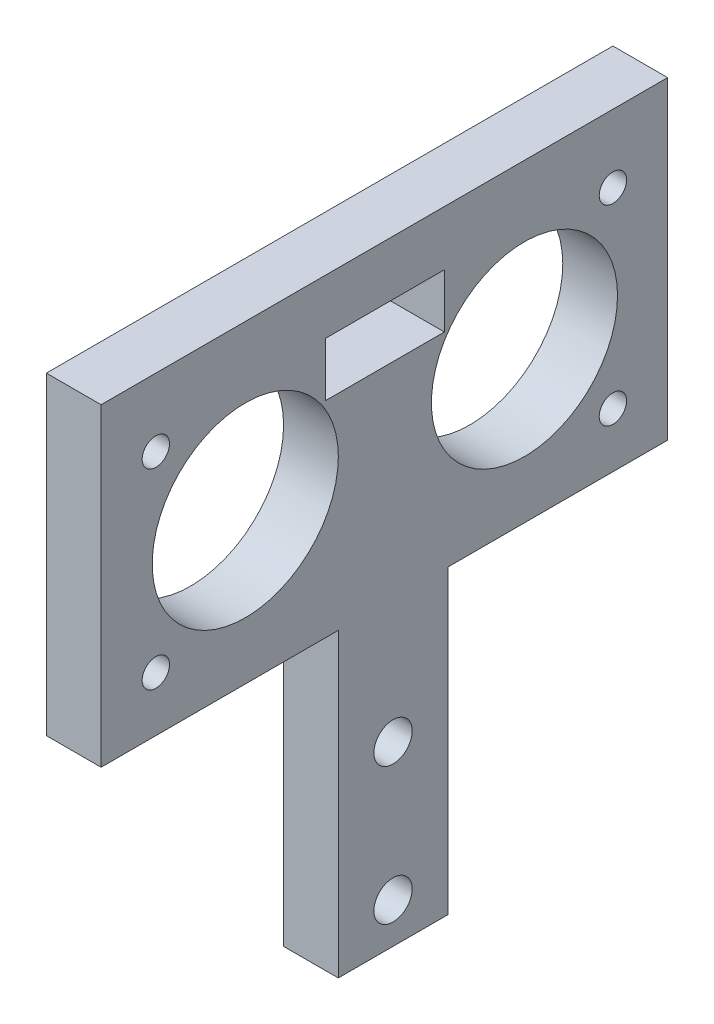
ISO-10303-21;
HEADER;
FILE_DESCRIPTION(('STEP AP214'),'2;1');
FILE_NAME('part.step','',(''),(''),'','','');
FILE_SCHEMA(('AUTOMOTIVE_DESIGN { 1 0 10303 214 1 1 1 1 }'));
ENDSEC;
DATA;
#1=APPLICATION_CONTEXT('core data for automotive mechanical design processes');
#2=APPLICATION_PROTOCOL_DEFINITION('international standard','automotive_design',2000,#1);
#3=PRODUCT_CONTEXT('',#1,'mechanical');
#4=PRODUCT('Part','Part','',(#3));
#5=PRODUCT_RELATED_PRODUCT_CATEGORY('part','',(#4));
#6=PRODUCT_DEFINITION_FORMATION('','',#4);
#7=PRODUCT_DEFINITION_CONTEXT('part definition',#1,'design');
#8=PRODUCT_DEFINITION('design','',#6,#7);
#9=PRODUCT_DEFINITION_SHAPE('','',#8);
#10=(LENGTH_UNIT() NAMED_UNIT(*) SI_UNIT(.MILLI.,.METRE.));
#11=(NAMED_UNIT(*) PLANE_ANGLE_UNIT() SI_UNIT($,.RADIAN.));
#12=(NAMED_UNIT(*) SI_UNIT($,.STERADIAN.) SOLID_ANGLE_UNIT());
#13=UNCERTAINTY_MEASURE_WITH_UNIT(LENGTH_MEASURE(1.E-05),#10,'distance_accuracy_value','');
#14=(GEOMETRIC_REPRESENTATION_CONTEXT(3) GLOBAL_UNCERTAINTY_ASSIGNED_CONTEXT((#13)) GLOBAL_UNIT_ASSIGNED_CONTEXT((#10,
#11,#12)) REPRESENTATION_CONTEXT('',''));
#15=CARTESIAN_POINT('',(0.,0.,0.));
#16=DIRECTION('',(0.,0.,1.));
#17=DIRECTION('',(1.,0.,0.));
#18=AXIS2_PLACEMENT_3D('',#15,#16,#17);
#19=CARTESIAN_POINT('',(0.,0.,0.));
#20=DIRECTION('',(1.,0.,0.));
#21=DIRECTION('',(0.,0.,-1.));
#22=AXIS2_PLACEMENT_3D('',#19,#20,#21);
#23=PLANE('',#22);
#24=CARTESIAN_POINT('',(0.,-48.26,0.));
#25=DIRECTION('',(1.,0.,0.));
#26=DIRECTION('',(0.,0.,-1.));
#27=AXIS2_PLACEMENT_3D('',#24,#25,#26);
#28=CIRCLE('',#27,1.778);
#29=CARTESIAN_POINT('',(0.,-48.26,1.778));
#30=VERTEX_POINT('',#29);
#31=EDGE_CURVE('E248',#30,#30,#28,.T.);
#32=ORIENTED_EDGE('',*,*,#31,.T.);
#33=EDGE_LOOP('',(#32));
#34=FACE_BOUND('',#33,.T.);
#35=CARTESIAN_POINT('',(0.,-35.56,0.));
#36=DIRECTION('',(1.,0.,0.));
#37=DIRECTION('',(0.,0.,-1.));
#38=AXIS2_PLACEMENT_3D('',#35,#36,#37);
#39=CIRCLE('',#38,1.778);
#40=CARTESIAN_POINT('',(0.,-35.56,1.778));
#41=VERTEX_POINT('',#40);
#42=EDGE_CURVE('E253',#41,#41,#39,.T.);
#43=ORIENTED_EDGE('',*,*,#42,.T.);
#44=EDGE_LOOP('',(#43));
#45=FACE_BOUND('',#44,.T.);
#46=CARTESIAN_POINT('',(0.,-10.1005701276087,-12.1970297029703));
#47=DIRECTION('',(1.,0.,0.));
#48=DIRECTION('',(0.,0.,-1.));
#49=AXIS2_PLACEMENT_3D('',#46,#47,#48);
#50=CIRCLE('',#49,8.636);
#51=CARTESIAN_POINT('',(0.,-10.1005701276087,-20.8330297029703));
#52=VERTEX_POINT('',#51);
#53=EDGE_CURVE('E176',#52,#52,#50,.T.);
#54=ORIENTED_EDGE('',*,*,#53,.T.);
#55=EDGE_LOOP('',(#54));
#56=FACE_BOUND('',#55,.T.);
#57=CARTESIAN_POINT('',(0.,-10.1005701276087,13.7109702970297));
#58=DIRECTION('',(1.,0.,0.));
#59=DIRECTION('',(0.,0.,-1.));
#60=AXIS2_PLACEMENT_3D('',#57,#58,#59);
#61=CIRCLE('',#60,8.636);
#62=CARTESIAN_POINT('',(0.,-10.1005701276087,5.07497029702969));
#63=VERTEX_POINT('',#62);
#64=EDGE_CURVE('E175',#63,#63,#61,.T.);
#65=ORIENTED_EDGE('',*,*,#64,.T.);
#66=EDGE_LOOP('',(#65));
#67=FACE_BOUND('',#66,.T.);
#68=CARTESIAN_POINT('',(0.,-1.22390774690241,22.0101702970577));
#69=DIRECTION('',(1.,0.,0.));
#70=DIRECTION('',(0.,0.,-1.));
#71=AXIS2_PLACEMENT_3D('',#68,#69,#70);
#72=CIRCLE('',#71,1.27);
#73=CARTESIAN_POINT('',(0.,-1.22390774690241,20.7401702970577));
#74=VERTEX_POINT('',#73);
#75=EDGE_CURVE('E224',#74,#74,#72,.T.);
#76=ORIENTED_EDGE('',*,*,#75,.T.);
#77=EDGE_LOOP('',(#76));
#78=FACE_BOUND('',#77,.T.);
#79=CARTESIAN_POINT('',(0.,-18.9772325083057,22.0101702970577));
#80=DIRECTION('',(1.,0.,0.));
#81=DIRECTION('',(0.,0.,1.));
#82=AXIS2_PLACEMENT_3D('',#79,#80,#81);
#83=CIRCLE('',#82,1.27);
#84=CARTESIAN_POINT('',(0.,-18.9772325083057,23.2801702970577));
#85=VERTEX_POINT('',#84);
#86=EDGE_CURVE('E221',#85,#85,#83,.T.);
#87=ORIENTED_EDGE('',*,*,#86,.T.);
#88=EDGE_LOOP('',(#87));
#89=FACE_BOUND('',#88,.T.);
#90=CARTESIAN_POINT('',(0.,-18.9772325083057,-20.4042297029423));
#91=DIRECTION('',(1.,0.,0.));
#92=DIRECTION('',(0.,0.,-1.));
#93=AXIS2_PLACEMENT_3D('',#90,#91,#92);
#94=CIRCLE('',#93,1.27);
#95=CARTESIAN_POINT('',(0.,-18.9772325083057,-21.6742297029423));
#96=VERTEX_POINT('',#95);
#97=EDGE_CURVE('E225',#96,#96,#94,.T.);
#98=ORIENTED_EDGE('',*,*,#97,.T.);
#99=EDGE_LOOP('',(#98));
#100=FACE_BOUND('',#99,.T.);
#101=CARTESIAN_POINT('',(0.,-1.22390774690241,-20.4042297029423));
#102=DIRECTION('',(1.,0.,0.));
#103=DIRECTION('',(0.,0.,1.));
#104=AXIS2_PLACEMENT_3D('',#101,#102,#103);
#105=CIRCLE('',#104,1.27);
#106=CARTESIAN_POINT('',(0.,-1.22390774690241,-19.1342297029423));
#107=VERTEX_POINT('',#106);
#108=EDGE_CURVE('E220',#107,#107,#105,.T.);
#109=ORIENTED_EDGE('',*,*,#108,.T.);
#110=EDGE_LOOP('',(#109));
#111=FACE_BOUND('',#110,.T.);
#112=DIRECTION('',(0.,-1.,0.));
#113=VECTOR('',#112,1.);
#114=CARTESIAN_POINT('',(0.,7.11236625150491E-13,6.25821412550992));
#115=LINE('',#114,#113);
#116=CARTESIAN_POINT('',(0.,7.11236625150491E-13,6.25821412550992));
#117=VERTEX_POINT('',#116);
#118=CARTESIAN_POINT('',(0.,-5.00379999999929,6.25821412550992));
#119=VERTEX_POINT('',#118);
#120=EDGE_CURVE('E187',#117,#119,#115,.T.);
#121=ORIENTED_EDGE('',*,*,#120,.T.);
#122=DIRECTION('',(0.,0.,-1.));
#123=VECTOR('',#122,1.);
#124=CARTESIAN_POINT('',(0.,-5.00379999999929,6.25821412550992));
#125=LINE('',#124,#123);
#126=CARTESIAN_POINT('',(0.,-5.00379999999929,-4.76538587449008));
#127=VERTEX_POINT('',#126);
#128=EDGE_CURVE('E190',#119,#127,#125,.T.);
#129=ORIENTED_EDGE('',*,*,#128,.T.);
#130=DIRECTION('',(0.,1.,0.));
#131=VECTOR('',#130,1.);
#132=CARTESIAN_POINT('',(0.,7.11236625150491E-13,-4.76538587449008));
#133=LINE('',#132,#131);
#134=CARTESIAN_POINT('',(0.,7.11236625150491E-13,-4.76538587449008));
#135=VERTEX_POINT('',#134);
#136=EDGE_CURVE('E193',#127,#135,#133,.T.);
#137=ORIENTED_EDGE('',*,*,#136,.T.);
#138=DIRECTION('',(0.,0.,1.));
#139=VECTOR('',#138,1.);
#140=CARTESIAN_POINT('',(0.,7.11236625150491E-13,6.25821412550992));
#141=LINE('',#140,#139);
#142=EDGE_CURVE('E196',#135,#117,#141,.T.);
#143=ORIENTED_EDGE('',*,*,#142,.T.);
#144=EDGE_LOOP('',(#121,#129,#137,#143));
#145=FACE_BOUND('',#144,.T.);
#146=DIRECTION('',(0.,0.,1.));
#147=VECTOR('',#146,1.);
#148=CARTESIAN_POINT('',(0.,-51.9972325083057,40.4730871411358));
#149=LINE('',#148,#147);
#150=CARTESIAN_POINT('',(0.,-51.9972325083057,-5.07999999999999));
#151=VERTEX_POINT('',#150);
#152=CARTESIAN_POINT('',(0.,-51.9972325083057,5.07999999999999));
#153=VERTEX_POINT('',#152);
#154=EDGE_CURVE('E120',#151,#153,#149,.T.);
#155=ORIENTED_EDGE('',*,*,#154,.T.);
#156=DIRECTION('',(0.,1.,0.));
#157=VECTOR('',#156,1.);
#158=CARTESIAN_POINT('',(0.,-24.0572325083057,5.08));
#159=LINE('',#158,#157);
#160=CARTESIAN_POINT('',(0.,-24.0572325083057,5.08));
#161=VERTEX_POINT('',#160);
#162=EDGE_CURVE('E141',#153,#161,#159,.T.);
#163=ORIENTED_EDGE('',*,*,#162,.T.);
#164=DIRECTION('',(0.,0.,1.));
#165=VECTOR('',#164,1.);
#166=CARTESIAN_POINT('',(0.,-24.0572325083057,30.6593827177156));
#167=LINE('',#166,#165);
#168=CARTESIAN_POINT('',(0.,-24.0572325083057,27.0901702970577));
#169=VERTEX_POINT('',#168);
#170=EDGE_CURVE('E262',#161,#169,#167,.T.);
#171=ORIENTED_EDGE('',*,*,#170,.T.);
#172=DIRECTION('',(0.,-1.,0.));
#173=VECTOR('',#172,1.);
#174=CARTESIAN_POINT('',(0.,5.08,27.0901702970577));
#175=LINE('',#174,#173);
#176=CARTESIAN_POINT('',(0.,5.08,27.0901702970577));
#177=VERTEX_POINT('',#176);
#178=EDGE_CURVE('E155',#177,#169,#175,.T.);
#179=ORIENTED_EDGE('',*,*,#178,.F.);
#180=DIRECTION('',(0.,0.,1.));
#181=VECTOR('',#180,1.);
#182=CARTESIAN_POINT('',(0.,5.08,27.0901702970577));
#183=LINE('',#182,#181);
#184=CARTESIAN_POINT('',(0.,5.08,-25.4842297029423));
#185=VERTEX_POINT('',#184);
#186=EDGE_CURVE('E160',#185,#177,#183,.T.);
#187=ORIENTED_EDGE('',*,*,#186,.F.);
#188=DIRECTION('',(0.,1.,0.));
#189=VECTOR('',#188,1.);
#190=CARTESIAN_POINT('',(0.,5.08,-25.4842297029423));
#191=LINE('',#190,#189);
#192=CARTESIAN_POINT('',(0.,-24.0572325083057,-25.4842297029423));
#193=VERTEX_POINT('',#192);
#194=EDGE_CURVE('E158',#193,#185,#191,.T.);
#195=ORIENTED_EDGE('',*,*,#194,.F.);
#196=DIRECTION('',(0.,0.,1.));
#197=VECTOR('',#196,1.);
#198=CARTESIAN_POINT('',(0.,-24.0572325083057,-30.6593827177156));
#199=LINE('',#198,#197);
#200=CARTESIAN_POINT('',(0.,-24.0572325083057,-5.08));
#201=VERTEX_POINT('',#200);
#202=EDGE_CURVE('E136',#193,#201,#199,.T.);
#203=ORIENTED_EDGE('',*,*,#202,.T.);
#204=DIRECTION('',(0.,-1.,0.));
#205=VECTOR('',#204,1.);
#206=CARTESIAN_POINT('',(0.,-24.0572325083057,-5.08));
#207=LINE('',#206,#205);
#208=EDGE_CURVE('E133',#201,#151,#207,.T.);
#209=ORIENTED_EDGE('',*,*,#208,.T.);
#210=EDGE_LOOP('',(#155,#163,#171,#179,#187,#195,#203,#209));
#211=FACE_BOUND('',#210,.T.);
#212=ADVANCED_FACE('F32',(#34,#45,#56,#67,#78,#89,#100,#111,#145,#211),#23,.F.);
#213=CARTESIAN_POINT('',(5.08,0.,0.));
#214=DIRECTION('',(1.,0.,0.));
#215=DIRECTION('',(0.,0.,-1.));
#216=AXIS2_PLACEMENT_3D('',#213,#214,#215);
#217=PLANE('',#216);
#218=CARTESIAN_POINT('',(5.08,-48.26,0.));
#219=DIRECTION('',(1.,0.,0.));
#220=DIRECTION('',(0.,0.,-1.));
#221=AXIS2_PLACEMENT_3D('',#218,#219,#220);
#222=CIRCLE('',#221,1.778);
#223=CARTESIAN_POINT('',(5.08,-48.26,1.778));
#224=VERTEX_POINT('',#223);
#225=EDGE_CURVE('E35',#224,#224,#222,.F.);
#226=ORIENTED_EDGE('',*,*,#225,.T.);
#227=EDGE_LOOP('',(#226));
#228=FACE_BOUND('',#227,.T.);
#229=CARTESIAN_POINT('',(5.08,-35.56,0.));
#230=DIRECTION('',(1.,0.,0.));
#231=DIRECTION('',(0.,0.,-1.));
#232=AXIS2_PLACEMENT_3D('',#229,#230,#231);
#233=CIRCLE('',#232,1.778);
#234=CARTESIAN_POINT('',(5.08,-35.56,1.778));
#235=VERTEX_POINT('',#234);
#236=EDGE_CURVE('E246',#235,#235,#233,.F.);
#237=ORIENTED_EDGE('',*,*,#236,.T.);
#238=EDGE_LOOP('',(#237));
#239=FACE_BOUND('',#238,.T.);
#240=CARTESIAN_POINT('',(5.08,-10.1005701276087,-12.1970297029703));
#241=DIRECTION('',(1.,0.,0.));
#242=DIRECTION('',(0.,0.,-1.));
#243=AXIS2_PLACEMENT_3D('',#240,#241,#242);
#244=CIRCLE('',#243,8.636);
#245=CARTESIAN_POINT('',(5.08,-10.1005701276087,-20.8330297029703));
#246=VERTEX_POINT('',#245);
#247=EDGE_CURVE('E184',#246,#246,#244,.F.);
#248=ORIENTED_EDGE('',*,*,#247,.T.);
#249=EDGE_LOOP('',(#248));
#250=FACE_BOUND('',#249,.T.);
#251=CARTESIAN_POINT('',(5.08,-10.1005701276087,13.7109702970297));
#252=DIRECTION('',(1.,0.,0.));
#253=DIRECTION('',(0.,0.,-1.));
#254=AXIS2_PLACEMENT_3D('',#251,#252,#253);
#255=CIRCLE('',#254,8.636);
#256=CARTESIAN_POINT('',(5.08,-10.1005701276087,5.07497029702969));
#257=VERTEX_POINT('',#256);
#258=EDGE_CURVE('E179',#257,#257,#255,.F.);
#259=ORIENTED_EDGE('',*,*,#258,.T.);
#260=EDGE_LOOP('',(#259));
#261=FACE_BOUND('',#260,.T.);
#262=CARTESIAN_POINT('',(5.08,-1.22390774690241,-20.4042297029423));
#263=DIRECTION('',(1.,0.,0.));
#264=DIRECTION('',(0.,0.,-1.));
#265=AXIS2_PLACEMENT_3D('',#262,#263,#264);
#266=CIRCLE('',#265,1.27);
#267=CARTESIAN_POINT('',(5.08,-1.22390774690241,-21.6742297029423));
#268=VERTEX_POINT('',#267);
#269=EDGE_CURVE('E241',#268,#268,#266,.F.);
#270=ORIENTED_EDGE('',*,*,#269,.T.);
#271=EDGE_LOOP('',(#270));
#272=FACE_BOUND('',#271,.T.);
#273=CARTESIAN_POINT('',(5.08,-18.9772325083057,-20.4042297029423));
#274=DIRECTION('',(1.,0.,0.));
#275=DIRECTION('',(0.,0.,-1.));
#276=AXIS2_PLACEMENT_3D('',#273,#274,#275);
#277=CIRCLE('',#276,1.27);
#278=CARTESIAN_POINT('',(5.08,-18.9772325083057,-21.6742297029423));
#279=VERTEX_POINT('',#278);
#280=EDGE_CURVE('E238',#279,#279,#277,.F.);
#281=ORIENTED_EDGE('',*,*,#280,.T.);
#282=EDGE_LOOP('',(#281));
#283=FACE_BOUND('',#282,.T.);
#284=CARTESIAN_POINT('',(5.08,-18.9772325083057,22.0101702970577));
#285=DIRECTION('',(1.,0.,0.));
#286=DIRECTION('',(0.,0.,-1.));
#287=AXIS2_PLACEMENT_3D('',#284,#285,#286);
#288=CIRCLE('',#287,1.27);
#289=CARTESIAN_POINT('',(5.08,-18.9772325083057,20.7401702970577));
#290=VERTEX_POINT('',#289);
#291=EDGE_CURVE('E235',#290,#290,#288,.F.);
#292=ORIENTED_EDGE('',*,*,#291,.T.);
#293=EDGE_LOOP('',(#292));
#294=FACE_BOUND('',#293,.T.);
#295=CARTESIAN_POINT('',(5.08,-1.22390774690241,22.0101702970577));
#296=DIRECTION('',(1.,0.,0.));
#297=DIRECTION('',(0.,0.,-1.));
#298=AXIS2_PLACEMENT_3D('',#295,#296,#297);
#299=CIRCLE('',#298,1.27);
#300=CARTESIAN_POINT('',(5.08,-1.22390774690241,20.7401702970577));
#301=VERTEX_POINT('',#300);
#302=EDGE_CURVE('E232',#301,#301,#299,.F.);
#303=ORIENTED_EDGE('',*,*,#302,.T.);
#304=EDGE_LOOP('',(#303));
#305=FACE_BOUND('',#304,.T.);
#306=DIRECTION('',(0.,0.,1.));
#307=VECTOR('',#306,1.);
#308=CARTESIAN_POINT('',(5.08,-5.00379999999929,0.));
#309=LINE('',#308,#307);
#310=CARTESIAN_POINT('',(5.08,-5.00379999999929,-4.76538587449008));
#311=VERTEX_POINT('',#310);
#312=CARTESIAN_POINT('',(5.08,-5.00379999999929,6.25821412550992));
#313=VERTEX_POINT('',#312);
#314=EDGE_CURVE('E214',#311,#313,#309,.T.);
#315=ORIENTED_EDGE('',*,*,#314,.T.);
#316=DIRECTION('',(0.,1.,0.));
#317=VECTOR('',#316,1.);
#318=CARTESIAN_POINT('',(5.08,0.,6.25821412550992));
#319=LINE('',#318,#317);
#320=CARTESIAN_POINT('',(5.08,7.11236625150491E-13,6.25821412550992));
#321=VERTEX_POINT('',#320);
#322=EDGE_CURVE('E217',#313,#321,#319,.T.);
#323=ORIENTED_EDGE('',*,*,#322,.T.);
#324=DIRECTION('',(0.,0.,-1.));
#325=VECTOR('',#324,1.);
#326=CARTESIAN_POINT('',(5.08,7.11236625150491E-13,0.));
#327=LINE('',#326,#325);
#328=CARTESIAN_POINT('',(5.08,7.11236625150491E-13,-4.76538587449008));
#329=VERTEX_POINT('',#328);
#330=EDGE_CURVE('E208',#321,#329,#327,.T.);
#331=ORIENTED_EDGE('',*,*,#330,.T.);
#332=DIRECTION('',(0.,-1.,0.));
#333=VECTOR('',#332,1.);
#334=CARTESIAN_POINT('',(5.08,0.,-4.76538587449008));
#335=LINE('',#334,#333);
#336=EDGE_CURVE('E211',#329,#311,#335,.T.);
#337=ORIENTED_EDGE('',*,*,#336,.T.);
#338=EDGE_LOOP('',(#315,#323,#331,#337));
#339=FACE_BOUND('',#338,.T.);
#340=DIRECTION('',(0.,-1.,0.));
#341=VECTOR('',#340,1.);
#342=CARTESIAN_POINT('',(5.08,0.,5.08));
#343=LINE('',#342,#341);
#344=CARTESIAN_POINT('',(5.08,-24.0572325083057,5.08));
#345=VERTEX_POINT('',#344);
#346=CARTESIAN_POINT('',(5.08,-51.9972325083057,5.07999999999999));
#347=VERTEX_POINT('',#346);
#348=EDGE_CURVE('E152',#345,#347,#343,.T.);
#349=ORIENTED_EDGE('',*,*,#348,.T.);
#350=DIRECTION('',(0.,0.,-1.));
#351=VECTOR('',#350,1.);
#352=CARTESIAN_POINT('',(5.08,-51.9972325083057,0.));
#353=LINE('',#352,#351);
#354=CARTESIAN_POINT('',(5.08,-51.9972325083057,-5.08));
#355=VERTEX_POINT('',#354);
#356=EDGE_CURVE('E48',#347,#355,#353,.T.);
#357=ORIENTED_EDGE('',*,*,#356,.T.);
#358=DIRECTION('',(0.,1.,0.));
#359=VECTOR('',#358,1.);
#360=CARTESIAN_POINT('',(5.08,0.,-5.08));
#361=LINE('',#360,#359);
#362=CARTESIAN_POINT('',(5.08,-24.0572325083057,-5.08));
#363=VERTEX_POINT('',#362);
#364=EDGE_CURVE('E135',#355,#363,#361,.T.);
#365=ORIENTED_EDGE('',*,*,#364,.T.);
#366=DIRECTION('',(0.,0.,-1.));
#367=VECTOR('',#366,1.);
#368=CARTESIAN_POINT('',(5.08,-24.0572325083057,0.));
#369=LINE('',#368,#367);
#370=CARTESIAN_POINT('',(5.08,-24.0572325083057,-25.4842297029423));
#371=VERTEX_POINT('',#370);
#372=EDGE_CURVE('E146',#363,#371,#369,.T.);
#373=ORIENTED_EDGE('',*,*,#372,.T.);
#374=DIRECTION('',(0.,-1.,0.));
#375=VECTOR('',#374,1.);
#376=CARTESIAN_POINT('',(5.08,0.,-25.4842297029423));
#377=LINE('',#376,#375);
#378=CARTESIAN_POINT('',(5.08,5.08,-25.4842297029423));
#379=VERTEX_POINT('',#378);
#380=EDGE_CURVE('E170',#379,#371,#377,.T.);
#381=ORIENTED_EDGE('',*,*,#380,.F.);
#382=DIRECTION('',(0.,0.,-1.));
#383=VECTOR('',#382,1.);
#384=CARTESIAN_POINT('',(5.08,5.08,0.));
#385=LINE('',#384,#383);
#386=CARTESIAN_POINT('',(5.08,5.08,27.0901702970577));
#387=VERTEX_POINT('',#386);
#388=EDGE_CURVE('E168',#387,#379,#385,.T.);
#389=ORIENTED_EDGE('',*,*,#388,.F.);
#390=DIRECTION('',(0.,1.,0.));
#391=VECTOR('',#390,1.);
#392=CARTESIAN_POINT('',(5.08,0.,27.0901702970577));
#393=LINE('',#392,#391);
#394=CARTESIAN_POINT('',(5.08,-24.0572325083057,27.0901702970577));
#395=VERTEX_POINT('',#394);
#396=EDGE_CURVE('E173',#395,#387,#393,.T.);
#397=ORIENTED_EDGE('',*,*,#396,.F.);
#398=DIRECTION('',(0.,0.,-1.));
#399=VECTOR('',#398,1.);
#400=CARTESIAN_POINT('',(5.08,-24.0572325083057,0.));
#401=LINE('',#400,#399);
#402=EDGE_CURVE('E55',#395,#345,#401,.T.);
#403=ORIENTED_EDGE('',*,*,#402,.T.);
#404=EDGE_LOOP('',(#349,#357,#365,#373,#381,#389,#397,#403));
#405=FACE_BOUND('',#404,.T.);
#406=ADVANCED_FACE('F287',(#228,#239,#250,#261,#272,#283,#294,#305,#339,#405),#217,.T.);
#407=CARTESIAN_POINT('',(10.16,-24.0572325083057,-5.08));
#408=DIRECTION('',(0.,0.,-1.));
#409=DIRECTION('',(0.,1.,0.));
#410=AXIS2_PLACEMENT_3D('',#407,#408,#409);
#411=PLANE('',#410);
#412=ORIENTED_EDGE('',*,*,#364,.F.);
#413=DIRECTION('',(-1.,0.,0.));
#414=VECTOR('',#413,1.);
#415=CARTESIAN_POINT('',(10.16,-51.9972325083057,-5.07999999999999));
#416=LINE('',#415,#414);
#417=EDGE_CURVE('E123',#355,#151,#416,.T.);
#418=ORIENTED_EDGE('',*,*,#417,.T.);
#419=ORIENTED_EDGE('',*,*,#208,.F.);
#420=DIRECTION('',(-1.,0.,0.));
#421=VECTOR('',#420,1.);
#422=CARTESIAN_POINT('',(10.16,-24.0572325083057,-5.08));
#423=LINE('',#422,#421);
#424=EDGE_CURVE('E139',#363,#201,#423,.T.);
#425=ORIENTED_EDGE('',*,*,#424,.F.);
#426=EDGE_LOOP('',(#412,#418,#419,#425));
#427=FACE_BOUND('',#426,.T.);
#428=ADVANCED_FACE('F131',(#427),#411,.T.);
#429=CARTESIAN_POINT('',(10.16,-24.0572325083057,5.08));
#430=DIRECTION('',(0.,0.,1.));
#431=DIRECTION('',(0.,-1.,0.));
#432=AXIS2_PLACEMENT_3D('',#429,#430,#431);
#433=PLANE('',#432);
#434=ORIENTED_EDGE('',*,*,#162,.F.);
#435=DIRECTION('',(1.,0.,0.));
#436=VECTOR('',#435,1.);
#437=CARTESIAN_POINT('',(10.16,-51.9972325083057,5.07999999999999));
#438=LINE('',#437,#436);
#439=EDGE_CURVE('E11',#153,#347,#438,.T.);
#440=ORIENTED_EDGE('',*,*,#439,.T.);
#441=ORIENTED_EDGE('',*,*,#348,.F.);
#442=DIRECTION('',(-1.,0.,0.));
#443=VECTOR('',#442,1.);
#444=CARTESIAN_POINT('',(10.16,-24.0572325083057,5.08));
#445=LINE('',#444,#443);
#446=EDGE_CURVE('E149',#345,#161,#445,.T.);
#447=ORIENTED_EDGE('',*,*,#446,.T.);
#448=EDGE_LOOP('',(#434,#440,#441,#447));
#449=FACE_BOUND('',#448,.T.);
#450=ADVANCED_FACE('F267',(#449),#433,.T.);
#451=CARTESIAN_POINT('',(25.908,5.08,27.0901702970577));
#452=DIRECTION('',(0.,0.,-1.));
#453=DIRECTION('',(0.,1.,0.));
#454=AXIS2_PLACEMENT_3D('',#451,#452,#453);
#455=PLANE('',#454);
#456=DIRECTION('',(-1.,0.,0.));
#457=VECTOR('',#456,1.);
#458=CARTESIAN_POINT('',(25.908,-24.0572325083057,27.0901702970577));
#459=LINE('',#458,#457);
#460=EDGE_CURVE('E40',#395,#169,#459,.T.);
#461=ORIENTED_EDGE('',*,*,#460,.F.);
#462=ORIENTED_EDGE('',*,*,#396,.T.);
#463=DIRECTION('',(-1.,0.,0.));
#464=VECTOR('',#463,1.);
#465=CARTESIAN_POINT('',(25.908,5.08,27.0901702970577));
#466=LINE('',#465,#464);
#467=EDGE_CURVE('E163',#387,#177,#466,.T.);
#468=ORIENTED_EDGE('',*,*,#467,.T.);
#469=ORIENTED_EDGE('',*,*,#178,.T.);
#470=EDGE_LOOP('',(#461,#462,#468,#469));
#471=FACE_BOUND('',#470,.T.);
#472=ADVANCED_FACE('F272',(#471),#455,.F.);
#473=CARTESIAN_POINT('',(25.908,5.08,-25.4842297029423));
#474=DIRECTION('',(0.,0.,1.));
#475=DIRECTION('',(0.,-1.,0.));
#476=AXIS2_PLACEMENT_3D('',#473,#474,#475);
#477=PLANE('',#476);
#478=DIRECTION('',(1.,0.,0.));
#479=VECTOR('',#478,1.);
#480=CARTESIAN_POINT('',(25.908,-24.0572325083057,-25.4842297029423));
#481=LINE('',#480,#479);
#482=EDGE_CURVE('E244',#193,#371,#481,.T.);
#483=ORIENTED_EDGE('',*,*,#482,.F.);
#484=ORIENTED_EDGE('',*,*,#194,.T.);
#485=DIRECTION('',(-1.,0.,0.));
#486=VECTOR('',#485,1.);
#487=CARTESIAN_POINT('',(25.908,5.08,-25.4842297029423));
#488=LINE('',#487,#486);
#489=EDGE_CURVE('E165',#379,#185,#488,.T.);
#490=ORIENTED_EDGE('',*,*,#489,.F.);
#491=ORIENTED_EDGE('',*,*,#380,.T.);
#492=EDGE_LOOP('',(#483,#484,#490,#491));
#493=FACE_BOUND('',#492,.T.);
#494=ADVANCED_FACE('F281',(#493),#477,.F.);
#495=CARTESIAN_POINT('',(25.908,-1.22390774690241,22.0101702970577));
#496=DIRECTION('',(-1.,0.,0.));
#497=DIRECTION('',(0.,0.,1.));
#498=AXIS2_PLACEMENT_3D('',#495,#496,#497);
#499=CYLINDRICAL_SURFACE('',#498,1.27);
#500=ORIENTED_EDGE('',*,*,#302,.F.);
#501=EDGE_LOOP('',(#500));
#502=FACE_BOUND('',#501,.T.);
#503=ORIENTED_EDGE('',*,*,#75,.F.);
#504=EDGE_LOOP('',(#503));
#505=FACE_BOUND('',#504,.T.);
#506=ADVANCED_FACE('F296',(#502,#505),#499,.F.);
#507=CARTESIAN_POINT('',(25.908,-18.9772325083057,22.0101702970577));
#508=DIRECTION('',(-1.,0.,0.));
#509=DIRECTION('',(0.,0.,1.));
#510=AXIS2_PLACEMENT_3D('',#507,#508,#509);
#511=CYLINDRICAL_SURFACE('',#510,1.27);
#512=ORIENTED_EDGE('',*,*,#291,.F.);
#513=EDGE_LOOP('',(#512));
#514=FACE_BOUND('',#513,.T.);
#515=ORIENTED_EDGE('',*,*,#86,.F.);
#516=EDGE_LOOP('',(#515));
#517=FACE_BOUND('',#516,.T.);
#518=ADVANCED_FACE('F299',(#514,#517),#511,.F.);
#519=CARTESIAN_POINT('',(25.908,-18.9772325083057,-20.4042297029423));
#520=DIRECTION('',(-1.,0.,0.));
#521=DIRECTION('',(0.,0.,1.));
#522=AXIS2_PLACEMENT_3D('',#519,#520,#521);
#523=CYLINDRICAL_SURFACE('',#522,1.27);
#524=ORIENTED_EDGE('',*,*,#280,.F.);
#525=EDGE_LOOP('',(#524));
#526=FACE_BOUND('',#525,.T.);
#527=ORIENTED_EDGE('',*,*,#97,.F.);
#528=EDGE_LOOP('',(#527));
#529=FACE_BOUND('',#528,.T.);
#530=ADVANCED_FACE('F305',(#526,#529),#523,.F.);
#531=CARTESIAN_POINT('',(25.908,-1.22390774690241,-20.4042297029423));
#532=DIRECTION('',(-1.,0.,0.));
#533=DIRECTION('',(0.,0.,1.));
#534=AXIS2_PLACEMENT_3D('',#531,#532,#533);
#535=CYLINDRICAL_SURFACE('',#534,1.27);
#536=ORIENTED_EDGE('',*,*,#269,.F.);
#537=EDGE_LOOP('',(#536));
#538=FACE_BOUND('',#537,.T.);
#539=ORIENTED_EDGE('',*,*,#108,.F.);
#540=EDGE_LOOP('',(#539));
#541=FACE_BOUND('',#540,.T.);
#542=ADVANCED_FACE('F301',(#538,#541),#535,.F.);
#543=CARTESIAN_POINT('',(25.908,7.11236625150491E-13,6.25821412550992));
#544=DIRECTION('',(0.,0.,-1.));
#545=DIRECTION('',(0.,1.,0.));
#546=AXIS2_PLACEMENT_3D('',#543,#544,#545);
#547=PLANE('',#546);
#548=DIRECTION('',(-1.,0.,0.));
#549=VECTOR('',#548,1.);
#550=CARTESIAN_POINT('',(25.908,-5.00379999999929,6.25821412550992));
#551=LINE('',#550,#549);
#552=EDGE_CURVE('E206',#313,#119,#551,.T.);
#553=ORIENTED_EDGE('',*,*,#552,.T.);
#554=ORIENTED_EDGE('',*,*,#120,.F.);
#555=DIRECTION('',(-1.,0.,0.));
#556=VECTOR('',#555,1.);
#557=CARTESIAN_POINT('',(25.908,7.11236625150491E-13,6.25821412550992));
#558=LINE('',#557,#556);
#559=EDGE_CURVE('E199',#321,#117,#558,.T.);
#560=ORIENTED_EDGE('',*,*,#559,.F.);
#561=ORIENTED_EDGE('',*,*,#322,.F.);
#562=EDGE_LOOP('',(#553,#554,#560,#561));
#563=FACE_BOUND('',#562,.T.);
#564=ADVANCED_FACE('F304',(#563),#547,.T.);
#565=CARTESIAN_POINT('',(25.908,-5.00379999999929,6.25821412550992));
#566=DIRECTION('',(0.,1.,0.));
#567=DIRECTION('',(0.,0.,1.));
#568=AXIS2_PLACEMENT_3D('',#565,#566,#567);
#569=PLANE('',#568);
#570=DIRECTION('',(-1.,0.,0.));
#571=VECTOR('',#570,1.);
#572=CARTESIAN_POINT('',(25.908,-5.00379999999929,-4.76538587449008));
#573=LINE('',#572,#571);
#574=EDGE_CURVE('E204',#311,#127,#573,.T.);
#575=ORIENTED_EDGE('',*,*,#574,.T.);
#576=ORIENTED_EDGE('',*,*,#128,.F.);
#577=ORIENTED_EDGE('',*,*,#552,.F.);
#578=ORIENTED_EDGE('',*,*,#314,.F.);
#579=EDGE_LOOP('',(#575,#576,#577,#578));
#580=FACE_BOUND('',#579,.T.);
#581=ADVANCED_FACE('F315',(#580),#569,.T.);
#582=CARTESIAN_POINT('',(25.908,7.11236625150491E-13,-4.76538587449008));
#583=DIRECTION('',(0.,0.,1.));
#584=DIRECTION('',(0.,-1.,0.));
#585=AXIS2_PLACEMENT_3D('',#582,#583,#584);
#586=PLANE('',#585);
#587=DIRECTION('',(-1.,0.,0.));
#588=VECTOR('',#587,1.);
#589=CARTESIAN_POINT('',(25.908,7.11236625150491E-13,-4.76538587449008));
#590=LINE('',#589,#588);
#591=EDGE_CURVE('E202',#329,#135,#590,.T.);
#592=ORIENTED_EDGE('',*,*,#591,.T.);
#593=ORIENTED_EDGE('',*,*,#136,.F.);
#594=ORIENTED_EDGE('',*,*,#574,.F.);
#595=ORIENTED_EDGE('',*,*,#336,.F.);
#596=EDGE_LOOP('',(#592,#593,#594,#595));
#597=FACE_BOUND('',#596,.T.);
#598=ADVANCED_FACE('F319',(#597),#586,.T.);
#599=CARTESIAN_POINT('',(25.908,7.11236625150491E-13,6.25821412550992));
#600=DIRECTION('',(0.,-1.,0.));
#601=DIRECTION('',(0.,0.,-1.));
#602=AXIS2_PLACEMENT_3D('',#599,#600,#601);
#603=PLANE('',#602);
#604=ORIENTED_EDGE('',*,*,#559,.T.);
#605=ORIENTED_EDGE('',*,*,#142,.F.);
#606=ORIENTED_EDGE('',*,*,#591,.F.);
#607=ORIENTED_EDGE('',*,*,#330,.F.);
#608=EDGE_LOOP('',(#604,#605,#606,#607));
#609=FACE_BOUND('',#608,.T.);
#610=ADVANCED_FACE('F323',(#609),#603,.T.);
#611=CARTESIAN_POINT('',(25.908,-10.1005701276087,13.7109702970297));
#612=DIRECTION('',(-1.,0.,0.));
#613=DIRECTION('',(0.,0.,1.));
#614=AXIS2_PLACEMENT_3D('',#611,#612,#613);
#615=CYLINDRICAL_SURFACE('',#614,8.636);
#616=ORIENTED_EDGE('',*,*,#258,.F.);
#617=EDGE_LOOP('',(#616));
#618=FACE_BOUND('',#617,.T.);
#619=ORIENTED_EDGE('',*,*,#64,.F.);
#620=EDGE_LOOP('',(#619));
#621=FACE_BOUND('',#620,.T.);
#622=ADVANCED_FACE('F327',(#618,#621),#615,.F.);
#623=CARTESIAN_POINT('',(25.908,-10.1005701276087,-12.1970297029703));
#624=DIRECTION('',(-1.,0.,0.));
#625=DIRECTION('',(0.,0.,1.));
#626=AXIS2_PLACEMENT_3D('',#623,#624,#625);
#627=CYLINDRICAL_SURFACE('',#626,8.636);
#628=ORIENTED_EDGE('',*,*,#247,.F.);
#629=EDGE_LOOP('',(#628));
#630=FACE_BOUND('',#629,.T.);
#631=ORIENTED_EDGE('',*,*,#53,.F.);
#632=EDGE_LOOP('',(#631));
#633=FACE_BOUND('',#632,.T.);
#634=ADVANCED_FACE('F331',(#630,#633),#627,.F.);
#635=CARTESIAN_POINT('',(25.908,5.08,27.0901702970577));
#636=DIRECTION('',(0.,-1.,0.));
#637=DIRECTION('',(0.,0.,-1.));
#638=AXIS2_PLACEMENT_3D('',#635,#636,#637);
#639=PLANE('',#638);
#640=ORIENTED_EDGE('',*,*,#388,.T.);
#641=ORIENTED_EDGE('',*,*,#489,.T.);
#642=ORIENTED_EDGE('',*,*,#186,.T.);
#643=ORIENTED_EDGE('',*,*,#467,.F.);
#644=EDGE_LOOP('',(#640,#641,#642,#643));
#645=FACE_BOUND('',#644,.T.);
#646=ADVANCED_FACE('F277',(#645),#639,.F.);
#647=CARTESIAN_POINT('',(10.16,-24.0572325083057,-30.6593827177156));
#648=DIRECTION('',(0.,-1.,0.));
#649=DIRECTION('',(0.,0.,-1.));
#650=AXIS2_PLACEMENT_3D('',#647,#648,#649);
#651=PLANE('',#650);
#652=ORIENTED_EDGE('',*,*,#424,.T.);
#653=ORIENTED_EDGE('',*,*,#202,.F.);
#654=ORIENTED_EDGE('',*,*,#482,.T.);
#655=ORIENTED_EDGE('',*,*,#372,.F.);
#656=EDGE_LOOP('',(#652,#653,#654,#655));
#657=FACE_BOUND('',#656,.T.);
#658=ADVANCED_FACE('F285',(#657),#651,.T.);
#659=CARTESIAN_POINT('',(10.16,-24.0572325083057,30.6593827177156));
#660=DIRECTION('',(0.,-1.,0.));
#661=DIRECTION('',(0.,0.,-1.));
#662=AXIS2_PLACEMENT_3D('',#659,#660,#661);
#663=PLANE('',#662);
#664=ORIENTED_EDGE('',*,*,#460,.T.);
#665=ORIENTED_EDGE('',*,*,#170,.F.);
#666=ORIENTED_EDGE('',*,*,#446,.F.);
#667=ORIENTED_EDGE('',*,*,#402,.F.);
#668=EDGE_LOOP('',(#664,#665,#666,#667));
#669=FACE_BOUND('',#668,.T.);
#670=ADVANCED_FACE('F268',(#669),#663,.T.);
#671=CARTESIAN_POINT('',(19.05,-51.9972325083057,40.4730871411358));
#672=DIRECTION('',(0.,-1.,0.));
#673=DIRECTION('',(0.,0.,-1.));
#674=AXIS2_PLACEMENT_3D('',#671,#672,#673);
#675=PLANE('',#674);
#676=ORIENTED_EDGE('',*,*,#356,.F.);
#677=ORIENTED_EDGE('',*,*,#439,.F.);
#678=ORIENTED_EDGE('',*,*,#154,.F.);
#679=ORIENTED_EDGE('',*,*,#417,.F.);
#680=EDGE_LOOP('',(#676,#677,#678,#679));
#681=FACE_BOUND('',#680,.T.);
#682=ADVANCED_FACE('F122',(#681),#675,.T.);
#683=CARTESIAN_POINT('',(19.05,-35.56,0.));
#684=DIRECTION('',(-1.,0.,0.));
#685=DIRECTION('',(0.,0.,1.));
#686=AXIS2_PLACEMENT_3D('',#683,#684,#685);
#687=CYLINDRICAL_SURFACE('',#686,1.778);
#688=CARTESIAN_POINT('',(5.08,-35.56,1.778));
#689=CARTESIAN_POINT('',(5.02708333333333,-35.56,1.778));
#690=CARTESIAN_POINT('',(4.97416666666667,-35.56,1.778));
#691=CARTESIAN_POINT('',(4.86833333333333,-35.56,1.778));
#692=CARTESIAN_POINT('',(4.81541666666667,-35.56,1.778));
#693=CARTESIAN_POINT('',(4.70958333333333,-35.56,1.778));
#694=CARTESIAN_POINT('',(4.65666666666667,-35.56,1.778));
#695=CARTESIAN_POINT('',(4.55083333333333,-35.56,1.778));
#696=CARTESIAN_POINT('',(4.49791666666667,-35.56,1.778));
#697=CARTESIAN_POINT('',(4.39208333333333,-35.56,1.778));
#698=CARTESIAN_POINT('',(4.33916666666667,-35.56,1.778));
#699=CARTESIAN_POINT('',(4.23333333333333,-35.56,1.778));
#700=CARTESIAN_POINT('',(4.18041666666667,-35.56,1.778));
#701=CARTESIAN_POINT('',(4.07458333333333,-35.56,1.778));
#702=CARTESIAN_POINT('',(4.02166666666667,-35.56,1.778));
#703=CARTESIAN_POINT('',(3.91583333333333,-35.56,1.778));
#704=CARTESIAN_POINT('',(3.86291666666667,-35.56,1.778));
#705=CARTESIAN_POINT('',(3.75708333333333,-35.56,1.778));
#706=CARTESIAN_POINT('',(3.70416666666667,-35.56,1.778));
#707=CARTESIAN_POINT('',(3.59833333333333,-35.56,1.778));
#708=CARTESIAN_POINT('',(3.54541666666667,-35.56,1.778));
#709=CARTESIAN_POINT('',(3.43958333333333,-35.56,1.778));
#710=CARTESIAN_POINT('',(3.38666666666667,-35.56,1.778));
#711=CARTESIAN_POINT('',(3.28083333333333,-35.56,1.778));
#712=CARTESIAN_POINT('',(3.22791666666667,-35.56,1.778));
#713=CARTESIAN_POINT('',(3.12208333333333,-35.56,1.778));
#714=CARTESIAN_POINT('',(3.06916666666667,-35.56,1.778));
#715=CARTESIAN_POINT('',(2.96333333333333,-35.56,1.778));
#716=CARTESIAN_POINT('',(2.91041666666667,-35.56,1.778));
#717=CARTESIAN_POINT('',(2.80458333333333,-35.56,1.778));
#718=CARTESIAN_POINT('',(2.75166666666667,-35.56,1.778));
#719=CARTESIAN_POINT('',(2.64583333333333,-35.56,1.778));
#720=CARTESIAN_POINT('',(2.59291666666667,-35.56,1.778));
#721=CARTESIAN_POINT('',(2.48708333333333,-35.56,1.778));
#722=CARTESIAN_POINT('',(2.43416666666667,-35.56,1.778));
#723=CARTESIAN_POINT('',(2.32833333333333,-35.56,1.778));
#724=CARTESIAN_POINT('',(2.27541666666667,-35.56,1.778));
#725=CARTESIAN_POINT('',(2.16958333333333,-35.56,1.778));
#726=CARTESIAN_POINT('',(2.11666666666667,-35.56,1.778));
#727=CARTESIAN_POINT('',(2.01083333333333,-35.56,1.778));
#728=CARTESIAN_POINT('',(1.95791666666667,-35.56,1.778));
#729=CARTESIAN_POINT('',(1.85208333333333,-35.56,1.778));
#730=CARTESIAN_POINT('',(1.79916666666667,-35.56,1.778));
#731=CARTESIAN_POINT('',(1.69333333333333,-35.56,1.778));
#732=CARTESIAN_POINT('',(1.64041666666667,-35.56,1.778));
#733=CARTESIAN_POINT('',(1.53458333333333,-35.56,1.778));
#734=CARTESIAN_POINT('',(1.48166666666667,-35.56,1.778));
#735=CARTESIAN_POINT('',(1.37583333333333,-35.56,1.778));
#736=CARTESIAN_POINT('',(1.32291666666667,-35.56,1.778));
#737=CARTESIAN_POINT('',(1.21708333333333,-35.56,1.778));
#738=CARTESIAN_POINT('',(1.16416666666667,-35.56,1.778));
#739=CARTESIAN_POINT('',(1.05833333333333,-35.56,1.778));
#740=CARTESIAN_POINT('',(1.00541666666667,-35.56,1.778));
#741=CARTESIAN_POINT('',(0.899583333333334,-35.56,1.778));
#742=CARTESIAN_POINT('',(0.846666666666667,-35.56,1.778));
#743=CARTESIAN_POINT('',(0.740833333333333,-35.56,1.778));
#744=CARTESIAN_POINT('',(0.687916666666667,-35.56,1.778));
#745=CARTESIAN_POINT('',(0.582083333333334,-35.56,1.778));
#746=CARTESIAN_POINT('',(0.529166666666667,-35.56,1.778));
#747=CARTESIAN_POINT('',(0.423333333333333,-35.56,1.778));
#748=CARTESIAN_POINT('',(0.370416666666666,-35.56,1.778));
#749=CARTESIAN_POINT('',(0.264583333333332,-35.56,1.778));
#750=CARTESIAN_POINT('',(0.211666666666666,-35.56,1.778));
#751=CARTESIAN_POINT('',(0.105833333333333,-35.56,1.778));
#752=CARTESIAN_POINT('',(0.0529166666666663,-35.56,1.778));
#753=CARTESIAN_POINT('',(0.,-35.56,1.778));
#754=B_SPLINE_CURVE_WITH_KNOTS('',3,(#688,#689,#690,#691,#692,#693,#694,#695,#696,#697,#698,
#699,#700,#701,#702,#703,#704,#705,#706,#707,#708,#709,#710,#711,#712,#713,#714,#715,#716,#717,
#718,#719,#720,#721,#722,#723,#724,#725,#726,#727,#728,#729,#730,#731,#732,#733,#734,#735,#736,
#737,#738,#739,#740,#741,#742,#743,#744,#745,#746,#747,#748,#749,#750,#751,#752,#753),
.UNSPECIFIED.,.F.,.F.,(4,2,2,2,2,2,2,2,2,2,2,2,2,2,2,2,2,2,2,2,2,2,2,2,2,2,2,2,2,2,2,2,4),(0.,
0.158749999999999,0.3175,0.476250000000001,0.635,0.793749999999999,0.9525,1.11125,1.27,1.42875,
1.5875,1.74625,1.905,2.06375,2.2225,2.38125,2.54,2.69875,2.8575,3.01625,3.175,3.33375,3.4925,
3.65125,3.81,3.96875,4.1275,4.28625,4.445,4.60375,4.7625,4.92125,5.08),.UNSPECIFIED.);
#755=EDGE_CURVE('BSEAM350',#235,#41,#754,.T.);
#756=ORIENTED_EDGE('',*,*,#236,.F.);
#757=ORIENTED_EDGE('',*,*,#42,.F.);
#758=ORIENTED_EDGE('',*,*,#755,.T.);
#759=ORIENTED_EDGE('',*,*,#755,.F.);
#760=EDGE_LOOP('',(#756,#758,#757,#759));
#761=FACE_BOUND('',#760,.T.);
#762=ADVANCED_FACE('F350',(#761),#687,.F.);
#763=CARTESIAN_POINT('',(19.05,-48.26,0.));
#764=DIRECTION('',(-1.,0.,0.));
#765=DIRECTION('',(0.,0.,1.));
#766=AXIS2_PLACEMENT_3D('',#763,#764,#765);
#767=CYLINDRICAL_SURFACE('',#766,1.778);
#768=CARTESIAN_POINT('',(5.08,-48.26,1.778));
#769=CARTESIAN_POINT('',(5.02708333333333,-48.26,1.778));
#770=CARTESIAN_POINT('',(4.97416666666667,-48.26,1.778));
#771=CARTESIAN_POINT('',(4.86833333333333,-48.26,1.778));
#772=CARTESIAN_POINT('',(4.81541666666667,-48.26,1.778));
#773=CARTESIAN_POINT('',(4.70958333333333,-48.26,1.778));
#774=CARTESIAN_POINT('',(4.65666666666667,-48.26,1.778));
#775=CARTESIAN_POINT('',(4.55083333333333,-48.26,1.778));
#776=CARTESIAN_POINT('',(4.49791666666667,-48.26,1.778));
#777=CARTESIAN_POINT('',(4.39208333333333,-48.26,1.778));
#778=CARTESIAN_POINT('',(4.33916666666667,-48.26,1.778));
#779=CARTESIAN_POINT('',(4.23333333333333,-48.26,1.778));
#780=CARTESIAN_POINT('',(4.18041666666667,-48.26,1.778));
#781=CARTESIAN_POINT('',(4.07458333333333,-48.26,1.778));
#782=CARTESIAN_POINT('',(4.02166666666667,-48.26,1.778));
#783=CARTESIAN_POINT('',(3.91583333333333,-48.26,1.778));
#784=CARTESIAN_POINT('',(3.86291666666667,-48.26,1.778));
#785=CARTESIAN_POINT('',(3.75708333333333,-48.26,1.778));
#786=CARTESIAN_POINT('',(3.70416666666667,-48.26,1.778));
#787=CARTESIAN_POINT('',(3.59833333333333,-48.26,1.778));
#788=CARTESIAN_POINT('',(3.54541666666667,-48.26,1.778));
#789=CARTESIAN_POINT('',(3.43958333333333,-48.26,1.778));
#790=CARTESIAN_POINT('',(3.38666666666667,-48.26,1.778));
#791=CARTESIAN_POINT('',(3.28083333333333,-48.26,1.778));
#792=CARTESIAN_POINT('',(3.22791666666667,-48.26,1.778));
#793=CARTESIAN_POINT('',(3.12208333333333,-48.26,1.778));
#794=CARTESIAN_POINT('',(3.06916666666667,-48.26,1.778));
#795=CARTESIAN_POINT('',(2.96333333333333,-48.26,1.778));
#796=CARTESIAN_POINT('',(2.91041666666667,-48.26,1.778));
#797=CARTESIAN_POINT('',(2.80458333333333,-48.26,1.778));
#798=CARTESIAN_POINT('',(2.75166666666667,-48.26,1.778));
#799=CARTESIAN_POINT('',(2.64583333333333,-48.26,1.778));
#800=CARTESIAN_POINT('',(2.59291666666667,-48.26,1.778));
#801=CARTESIAN_POINT('',(2.48708333333333,-48.26,1.778));
#802=CARTESIAN_POINT('',(2.43416666666667,-48.26,1.778));
#803=CARTESIAN_POINT('',(2.32833333333333,-48.26,1.778));
#804=CARTESIAN_POINT('',(2.27541666666667,-48.26,1.778));
#805=CARTESIAN_POINT('',(2.16958333333333,-48.26,1.778));
#806=CARTESIAN_POINT('',(2.11666666666667,-48.26,1.778));
#807=CARTESIAN_POINT('',(2.01083333333333,-48.26,1.778));
#808=CARTESIAN_POINT('',(1.95791666666667,-48.26,1.778));
#809=CARTESIAN_POINT('',(1.85208333333333,-48.26,1.778));
#810=CARTESIAN_POINT('',(1.79916666666667,-48.26,1.778));
#811=CARTESIAN_POINT('',(1.69333333333333,-48.26,1.778));
#812=CARTESIAN_POINT('',(1.64041666666667,-48.26,1.778));
#813=CARTESIAN_POINT('',(1.53458333333333,-48.26,1.778));
#814=CARTESIAN_POINT('',(1.48166666666667,-48.26,1.778));
#815=CARTESIAN_POINT('',(1.37583333333333,-48.26,1.778));
#816=CARTESIAN_POINT('',(1.32291666666667,-48.26,1.778));
#817=CARTESIAN_POINT('',(1.21708333333333,-48.26,1.778));
#818=CARTESIAN_POINT('',(1.16416666666667,-48.26,1.778));
#819=CARTESIAN_POINT('',(1.05833333333333,-48.26,1.778));
#820=CARTESIAN_POINT('',(1.00541666666667,-48.26,1.778));
#821=CARTESIAN_POINT('',(0.899583333333334,-48.26,1.778));
#822=CARTESIAN_POINT('',(0.846666666666667,-48.26,1.778));
#823=CARTESIAN_POINT('',(0.740833333333333,-48.26,1.778));
#824=CARTESIAN_POINT('',(0.687916666666667,-48.26,1.778));
#825=CARTESIAN_POINT('',(0.582083333333334,-48.26,1.778));
#826=CARTESIAN_POINT('',(0.529166666666667,-48.26,1.778));
#827=CARTESIAN_POINT('',(0.423333333333333,-48.26,1.778));
#828=CARTESIAN_POINT('',(0.370416666666666,-48.26,1.778));
#829=CARTESIAN_POINT('',(0.264583333333332,-48.26,1.778));
#830=CARTESIAN_POINT('',(0.211666666666666,-48.26,1.778));
#831=CARTESIAN_POINT('',(0.105833333333333,-48.26,1.778));
#832=CARTESIAN_POINT('',(0.0529166666666663,-48.26,1.778));
#833=CARTESIAN_POINT('',(0.,-48.26,1.778));
#834=B_SPLINE_CURVE_WITH_KNOTS('',3,(#768,#769,#770,#771,#772,#773,#774,#775,#776,#777,#778,
#779,#780,#781,#782,#783,#784,#785,#786,#787,#788,#789,#790,#791,#792,#793,#794,#795,#796,#797,
#798,#799,#800,#801,#802,#803,#804,#805,#806,#807,#808,#809,#810,#811,#812,#813,#814,#815,#816,
#817,#818,#819,#820,#821,#822,#823,#824,#825,#826,#827,#828,#829,#830,#831,#832,#833),
.UNSPECIFIED.,.F.,.F.,(4,2,2,2,2,2,2,2,2,2,2,2,2,2,2,2,2,2,2,2,2,2,2,2,2,2,2,2,2,2,2,2,4),(0.,
0.158749999999999,0.3175,0.476250000000001,0.635,0.793749999999999,0.9525,1.11125,1.27,1.42875,
1.5875,1.74625,1.905,2.06375,2.2225,2.38125,2.54,2.69875,2.8575,3.01625,3.175,3.33375,3.4925,
3.65125,3.81,3.96875,4.1275,4.28625,4.445,4.60375,4.7625,4.92125,5.08),.UNSPECIFIED.);
#835=EDGE_CURVE('BSEAM353',#224,#30,#834,.T.);
#836=ORIENTED_EDGE('',*,*,#225,.F.);
#837=ORIENTED_EDGE('',*,*,#31,.F.);
#838=ORIENTED_EDGE('',*,*,#835,.T.);
#839=ORIENTED_EDGE('',*,*,#835,.F.);
#840=EDGE_LOOP('',(#836,#838,#837,#839));
#841=FACE_BOUND('',#840,.T.);
#842=ADVANCED_FACE('F353',(#841),#767,.F.);
#843=CLOSED_SHELL('',(#212,#406,#428,#450,#472,#494,#506,#518,#530,#542,#564,#581,#598,#610,
#622,#634,#646,#658,#670,#682,#762,#842));
#844=MANIFOLD_SOLID_BREP('B2',#843);
#845=ADVANCED_BREP_SHAPE_REPRESENTATION('',(#18,#844),#14);
#846=SHAPE_DEFINITION_REPRESENTATION(#9,#845);
ENDSEC;
END-ISO-10303-21;
